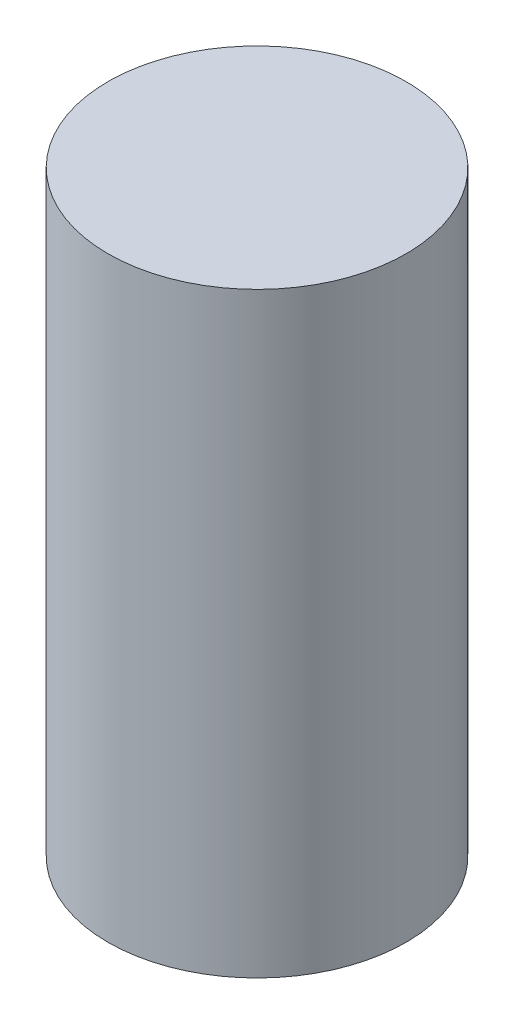
ISO-10303-21;
HEADER;
FILE_DESCRIPTION(('STEP AP214'),'2;1');
FILE_NAME('part.step','',(''),(''),'','','');
FILE_SCHEMA(('AUTOMOTIVE_DESIGN { 1 0 10303 214 1 1 1 1 }'));
ENDSEC;
DATA;
#1=APPLICATION_CONTEXT('core data for automotive mechanical design processes');
#2=APPLICATION_PROTOCOL_DEFINITION('international standard','automotive_design',2000,#1);
#3=PRODUCT_CONTEXT('',#1,'mechanical');
#4=PRODUCT('Part','Part','',(#3));
#5=PRODUCT_RELATED_PRODUCT_CATEGORY('part','',(#4));
#6=PRODUCT_DEFINITION_FORMATION('','',#4);
#7=PRODUCT_DEFINITION_CONTEXT('part definition',#1,'design');
#8=PRODUCT_DEFINITION('design','',#6,#7);
#9=PRODUCT_DEFINITION_SHAPE('','',#8);
#10=(LENGTH_UNIT() NAMED_UNIT(*) SI_UNIT(.MILLI.,.METRE.));
#11=(NAMED_UNIT(*) PLANE_ANGLE_UNIT() SI_UNIT($,.RADIAN.));
#12=(NAMED_UNIT(*) SI_UNIT($,.STERADIAN.) SOLID_ANGLE_UNIT());
#13=UNCERTAINTY_MEASURE_WITH_UNIT(LENGTH_MEASURE(1.E-05),#10,'distance_accuracy_value','');
#14=(GEOMETRIC_REPRESENTATION_CONTEXT(3) GLOBAL_UNCERTAINTY_ASSIGNED_CONTEXT((#13)) GLOBAL_UNIT_ASSIGNED_CONTEXT((#10,
#11,#12)) REPRESENTATION_CONTEXT('',''));
#15=CARTESIAN_POINT('',(0.,0.,0.));
#16=DIRECTION('',(0.,0.,1.));
#17=DIRECTION('',(1.,0.,0.));
#18=AXIS2_PLACEMENT_3D('',#15,#16,#17);
#19=CARTESIAN_POINT('',(0.,40.,0.));
#20=DIRECTION('',(0.,-1.,0.));
#21=DIRECTION('',(0.,0.,-1.));
#22=AXIS2_PLACEMENT_3D('',#19,#20,#21);
#23=CYLINDRICAL_SURFACE('',#22,10.);
#24=CARTESIAN_POINT('',(0.,32.5,-10.));
#25=CARTESIAN_POINT('',(-0.138126814449552,32.4999961237697,-9.99999766446687));
#26=CARTESIAN_POINT('',(-0.276296929717939,32.4885140820437,-9.99710963553044));
#27=CARTESIAN_POINT('',(-0.548677206284221,32.442958081155,-9.98586856383157));
#28=CARTESIAN_POINT('',(-0.682885078117899,32.4088713174369,-9.97751242366627));
#29=CARTESIAN_POINT('',(-0.943368120304297,32.3192679108965,-9.9562604388672));
#30=CARTESIAN_POINT('',(-1.06965260571667,32.2637770021412,-9.94337004736764));
#31=CARTESIAN_POINT('',(-1.31112021984072,32.1330310165919,-9.91442239679369));
#32=CARTESIAN_POINT('',(-1.42630297391461,32.0577752731351,-9.89836503090261));
#33=CARTESIAN_POINT('',(-1.64466987883486,31.8879986839097,-9.86445689319489));
#34=CARTESIAN_POINT('',(-1.74759281676843,31.7931473750682,-9.84657845246877));
#35=CARTESIAN_POINT('',(-1.93624821200554,31.5875796584849,-9.8112270019656));
#36=CARTESIAN_POINT('',(-2.02197872824866,31.4768614617551,-9.79375403816446));
#37=CARTESIAN_POINT('',(-2.17504423799829,31.240674622105,-9.76091292830281));
#38=CARTESIAN_POINT('',(-2.2420870265419,31.1150112819855,-9.74557990774685));
#39=CARTESIAN_POINT('',(-2.35399484758457,30.8537526472333,-9.71915824696694));
#40=CARTESIAN_POINT('',(-2.39886342573357,30.7181589444466,-9.70806892824031));
#41=CARTESIAN_POINT('',(-2.46425806134128,30.4437608363306,-9.69167461160538));
#42=CARTESIAN_POINT('',(-2.48525378055342,30.30507517327,-9.68625818328352));
#43=CARTESIAN_POINT('',(-2.50376962511068,30.0260523850011,-9.68148937432652));
#44=CARTESIAN_POINT('',(-2.50129356969685,29.8857155321798,-9.68213600713214));
#45=CARTESIAN_POINT('',(-2.47331087439951,29.6109736537577,-9.68932009194695));
#46=CARTESIAN_POINT('',(-2.44836390031772,29.4765072975578,-9.69571438345489));
#47=CARTESIAN_POINT('',(-2.37704031150499,29.2137315818149,-9.71344516118448));
#48=CARTESIAN_POINT('',(-2.33066217011566,29.0854226616185,-9.72478199948731));
#49=CARTESIAN_POINT('',(-2.21731579656198,28.8371033062464,-9.75125189842765));
#50=CARTESIAN_POINT('',(-2.1501444453882,28.717189713684,-9.76642212449693));
#51=CARTESIAN_POINT('',(-1.99726046002491,28.4901354837386,-9.79882851409985));
#52=CARTESIAN_POINT('',(-1.91154458134806,28.3829970865546,-9.81606503891047));
#53=CARTESIAN_POINT('',(-1.72110570780204,28.181327307176,-9.85126467566485));
#54=CARTESIAN_POINT('',(-1.61591043027643,28.0872425165644,-9.86923449130002));
#55=CARTESIAN_POINT('',(-1.39101986250616,27.9179645958935,-9.90343275964593));
#56=CARTESIAN_POINT('',(-1.27132412951324,27.8427720428941,-9.91966115915679));
#57=CARTESIAN_POINT('',(-1.02019314780232,27.7132490229594,-9.94862886823651));
#58=CARTESIAN_POINT('',(-0.888718988681038,27.6589910995759,-9.96135600212879));
#59=CARTESIAN_POINT('',(-0.618126680238136,27.5734711571507,-9.98179861652361));
#60=CARTESIAN_POINT('',(-0.479009998584139,27.5422047393031,-9.98951505565468));
#61=CARTESIAN_POINT('',(-0.200899950650044,27.5042373907353,-9.99892498785624));
#62=CARTESIAN_POINT('',(-0.0619945333136825,27.4969282898745,-10.0007675584713));
#63=CARTESIAN_POINT('',(0.215054791335848,27.5054150034258,-9.99864674690754));
#64=CARTESIAN_POINT('',(0.353198766074327,27.5212087379986,-9.99468388736421));
#65=CARTESIAN_POINT('',(0.622690447960818,27.5749515139856,-9.98149301878918));
#66=CARTESIAN_POINT('',(0.754108531614584,27.6125687724616,-9.97234390309647));
#67=CARTESIAN_POINT('',(1.00876215408753,27.7085118067141,-9.94981177723595));
#68=CARTESIAN_POINT('',(1.13199686505442,27.7668396738554,-9.93642833949965));
#69=CARTESIAN_POINT('',(1.36920522404972,27.9037268814578,-9.9065551321037));
#70=CARTESIAN_POINT('',(1.48297573639295,27.9826268539943,-9.89001445610999));
#71=CARTESIAN_POINT('',(1.69587768940552,28.1579831813286,-9.85574181979586));
#72=CARTESIAN_POINT('',(1.79500659828875,28.2544425660294,-9.83800965421578));
#73=CARTESIAN_POINT('',(1.97831761345414,28.4650032680728,-9.80281594932498));
#74=CARTESIAN_POINT('',(2.06207311270184,28.5794795049993,-9.78537173637463));
#75=CARTESIAN_POINT('',(2.20918459835605,28.8212210574476,-9.75321463970069));
#76=CARTESIAN_POINT('',(2.27254149026901,28.9484858049507,-9.73850163474941));
#77=CARTESIAN_POINT('',(2.37658570101224,29.2115095373437,-9.71363491194665));
#78=CARTESIAN_POINT('',(2.41740732773931,29.3472127138538,-9.70345425375809));
#79=CARTESIAN_POINT('',(2.47557609990489,29.6238493964255,-9.68877906706585));
#80=CARTESIAN_POINT('',(2.49292837912652,29.7647817517024,-9.68428329504044));
#81=CARTESIAN_POINT('',(2.50339765056083,30.0435350397693,-9.68158168701612));
#82=CARTESIAN_POINT('',(2.49719649630132,30.1813290585441,-9.68319887888034));
#83=CARTESIAN_POINT('',(2.46229546385366,30.4538398144438,-9.69213181672143));
#84=CARTESIAN_POINT('',(2.43359603781098,30.5885566133553,-9.69944744817732));
#85=CARTESIAN_POINT('',(2.35488553240495,30.8503474317764,-9.71885434473222));
#86=CARTESIAN_POINT('',(2.30500234113404,30.9774621754006,-9.73091692061057));
#87=CARTESIAN_POINT('',(2.18544152267504,31.2216089711893,-9.7584625954084));
#88=CARTESIAN_POINT('',(2.11576115005696,31.3386396219781,-9.77394616867808));
#89=CARTESIAN_POINT('',(1.95644624772859,31.5625910483368,-9.80709390439338));
#90=CARTESIAN_POINT('',(1.86633860485376,31.6691684557066,-9.82480441386302));
#91=CARTESIAN_POINT('',(1.66964895198288,31.8659117413257,-9.86013378743769));
#92=CARTESIAN_POINT('',(1.56306303543524,31.9560737168549,-9.87775262878422));
#93=CARTESIAN_POINT('',(1.33411264450432,32.1190188476077,-9.9112942607945));
#94=CARTESIAN_POINT('',(1.21149737052731,32.1914576894526,-9.92718055609783));
#95=CARTESIAN_POINT('',(0.955443432517463,32.3145791049009,-9.95508208291861));
#96=CARTESIAN_POINT('',(0.822012605727902,32.3652772677476,-9.96710008666302));
#97=CARTESIAN_POINT('',(0.574017088739122,32.4359530505494,-9.98413432609236));
#98=CARTESIAN_POINT('',(0.460633618180116,32.4599187384224,-9.99004308421151));
#99=CARTESIAN_POINT('',(0.23151011922714,32.4919432393699,-9.9979767538658));
#100=CARTESIAN_POINT('',(0.115770268737694,32.5000032488422,-10.0000019575149));
#101=CARTESIAN_POINT('',(0.,32.5,-10.));
#102=B_SPLINE_CURVE_WITH_KNOTS('',3,(#24,#25,#26,#27,#28,#29,#30,#31,#32,#33,#34,#35,#36,#37,
#38,#39,#40,#41,#42,#43,#44,#45,#46,#47,#48,#49,#50,#51,#52,#53,#54,#55,#56,#57,#58,#59,#60,#61,
#62,#63,#64,#65,#66,#67,#68,#69,#70,#71,#72,#73,#74,#75,#76,#77,#78,#79,#80,#81,#82,#83,#84,#85,
#86,#87,#88,#89,#90,#91,#92,#93,#94,#95,#96,#97,#98,#99,#100,#101),.UNSPECIFIED.,.T.,.F.,(4,2,2,
2,2,2,2,2,2,2,2,2,2,2,2,2,2,2,2,2,2,2,2,2,2,2,2,2,2,2,2,2,2,2,2,2,2,2,4),(0.,0.41395618745315,
0.828147062939833,1.24184150381018,1.65554990028222,2.07690725728566,2.4983121596677,
2.92597745909678,3.35357435282281,3.77260491835117,4.19156730193363,4.60037495017232,
5.00921172448932,5.42217546462,5.83521151399139,6.26002501620567,6.6848514926928,
7.11113715020725,7.5373412281994,7.95263848254329,8.36789835193439,8.7770045752893,
9.18615212209352,9.60255979281122,10.0190393835223,10.4457418201299,10.8724253125471,
11.2965375769764,11.7205570543048,12.1323963400749,12.5442273493652,12.9536066760888,
13.3630428023797,13.7831596069298,14.2033761629383,14.6312030917578,15.0587227304538,
15.4057040491338,15.752659267482),.UNSPECIFIED.);
#103=CARTESIAN_POINT('',(0.,32.5,-10.));
#104=VERTEX_POINT('',#103);
#105=EDGE_CURVE('E37',#104,#104,#102,.T.);
#106=ORIENTED_EDGE('',*,*,#105,.T.);
#107=EDGE_LOOP('',(#106));
#108=FACE_BOUND('',#107,.T.);
#109=CARTESIAN_POINT('',(0.,12.5,-10.));
#110=CARTESIAN_POINT('',(-0.138126814449552,12.4999961237697,-9.99999766446687));
#111=CARTESIAN_POINT('',(-0.276296929717938,12.4885140820437,-9.99710963553044));
#112=CARTESIAN_POINT('',(-0.548677206284221,12.442958081155,-9.98586856383157));
#113=CARTESIAN_POINT('',(-0.682885078117899,12.4088713174369,-9.97751242366627));
#114=CARTESIAN_POINT('',(-0.943368120304294,12.3192679108965,-9.9562604388672));
#115=CARTESIAN_POINT('',(-1.06965260571667,12.2637770021412,-9.94337004736764));
#116=CARTESIAN_POINT('',(-1.31112021984071,12.1330310165919,-9.91442239679369));
#117=CARTESIAN_POINT('',(-1.4263029739146,12.0577752731351,-9.89836503090261));
#118=CARTESIAN_POINT('',(-1.64466987883486,11.8879986839097,-9.86445689319489));
#119=CARTESIAN_POINT('',(-1.74759281676843,11.7931473750682,-9.84657845246877));
#120=CARTESIAN_POINT('',(-1.93624821200553,11.5875796584849,-9.8112270019656));
#121=CARTESIAN_POINT('',(-2.02197872824865,11.4768614617551,-9.79375403816446));
#122=CARTESIAN_POINT('',(-2.17504423799829,11.240674622105,-9.76091292830281));
#123=CARTESIAN_POINT('',(-2.2420870265419,11.1150112819855,-9.74557990774685));
#124=CARTESIAN_POINT('',(-2.35399484758457,10.8537526472333,-9.71915824696694));
#125=CARTESIAN_POINT('',(-2.39886342573357,10.7181589444466,-9.70806892824031));
#126=CARTESIAN_POINT('',(-2.46425806134127,10.4437608363306,-9.69167461160538));
#127=CARTESIAN_POINT('',(-2.48525378055342,10.30507517327,-9.68625818328352));
#128=CARTESIAN_POINT('',(-2.50376962511068,10.0260523850011,-9.68148937432652));
#129=CARTESIAN_POINT('',(-2.50129356969685,9.88571553217978,-9.68213600713214));
#130=CARTESIAN_POINT('',(-2.47331087439951,9.61097365375775,-9.68932009194695));
#131=CARTESIAN_POINT('',(-2.44836390031772,9.47650729755779,-9.69571438345489));
#132=CARTESIAN_POINT('',(-2.37704031150499,9.2137315818149,-9.71344516118448));
#133=CARTESIAN_POINT('',(-2.33066217011566,9.08542266161847,-9.72478199948731));
#134=CARTESIAN_POINT('',(-2.21731579656198,8.83710330624645,-9.75125189842765));
#135=CARTESIAN_POINT('',(-2.1501444453882,8.71718971368405,-9.76642212449693));
#136=CARTESIAN_POINT('',(-1.99726046002491,8.49013548373863,-9.79882851409985));
#137=CARTESIAN_POINT('',(-1.91154458134806,8.38299708655458,-9.81606503891047));
#138=CARTESIAN_POINT('',(-1.72110570780204,8.18132730717599,-9.85126467566485));
#139=CARTESIAN_POINT('',(-1.61591043027644,8.08724251656442,-9.86923449130001));
#140=CARTESIAN_POINT('',(-1.39101986250617,7.9179645958935,-9.90343275964594));
#141=CARTESIAN_POINT('',(-1.27132412951324,7.84277204289406,-9.91966115915679));
#142=CARTESIAN_POINT('',(-1.02019314780232,7.71324902295936,-9.94862886823651));
#143=CARTESIAN_POINT('',(-0.888718988681041,7.65899109957595,-9.96135600212879));
#144=CARTESIAN_POINT('',(-0.618126680238139,7.57347115715071,-9.98179861652361));
#145=CARTESIAN_POINT('',(-0.479009998584143,7.5422047393031,-9.98951505565468));
#146=CARTESIAN_POINT('',(-0.200899950650047,7.50423739073527,-9.99892498785624));
#147=CARTESIAN_POINT('',(-0.0619945333136857,7.49692828987449,-10.0007675584713));
#148=CARTESIAN_POINT('',(0.215054791335845,7.50541500342581,-9.99864674690754));
#149=CARTESIAN_POINT('',(0.353198766074325,7.52120873799856,-9.99468388736421));
#150=CARTESIAN_POINT('',(0.622690447960816,7.57495151398563,-9.98149301878918));
#151=CARTESIAN_POINT('',(0.754108531614582,7.61256877246162,-9.97234390309647));
#152=CARTESIAN_POINT('',(1.00876215408753,7.7085118067141,-9.94981177723595));
#153=CARTESIAN_POINT('',(1.13199686505442,7.76683967385537,-9.93642833949965));
#154=CARTESIAN_POINT('',(1.36920522404972,7.90372688145779,-9.9065551321037));
#155=CARTESIAN_POINT('',(1.48297573639294,7.98262685399427,-9.89001445610999));
#156=CARTESIAN_POINT('',(1.69587768940552,8.15798318132861,-9.85574181979586));
#157=CARTESIAN_POINT('',(1.79500659828875,8.25444256602941,-9.83800965421578));
#158=CARTESIAN_POINT('',(1.97831761345414,8.46500326807284,-9.80281594932498));
#159=CARTESIAN_POINT('',(2.06207311270184,8.57947950499927,-9.78537173637463));
#160=CARTESIAN_POINT('',(2.20918459835604,8.82122105744763,-9.75321463970069));
#161=CARTESIAN_POINT('',(2.27254149026901,8.94848580495074,-9.73850163474941));
#162=CARTESIAN_POINT('',(2.37658570101223,9.21150953734373,-9.71363491194665));
#163=CARTESIAN_POINT('',(2.41740732773931,9.34721271385382,-9.70345425375809));
#164=CARTESIAN_POINT('',(2.47557609990489,9.62384939642549,-9.68877906706586));
#165=CARTESIAN_POINT('',(2.49292837912652,9.76478175170241,-9.68428329504044));
#166=CARTESIAN_POINT('',(2.50339765056083,10.0435350397693,-9.68158168701612));
#167=CARTESIAN_POINT('',(2.49719649630132,10.1813290585441,-9.68319887888034));
#168=CARTESIAN_POINT('',(2.46229546385366,10.4538398144438,-9.69213181672143));
#169=CARTESIAN_POINT('',(2.43359603781098,10.5885566133553,-9.69944744817731));
#170=CARTESIAN_POINT('',(2.35488553240496,10.8503474317764,-9.71885434473222));
#171=CARTESIAN_POINT('',(2.30500234113404,10.9774621754005,-9.73091692061057));
#172=CARTESIAN_POINT('',(2.18544152267504,11.2216089711893,-9.7584625954084));
#173=CARTESIAN_POINT('',(2.11576115005696,11.3386396219781,-9.77394616867808));
#174=CARTESIAN_POINT('',(1.95644624772858,11.5625910483368,-9.80709390439337));
#175=CARTESIAN_POINT('',(1.86633860485376,11.6691684557066,-9.82480441386302));
#176=CARTESIAN_POINT('',(1.66964895198289,11.8659117413257,-9.86013378743769));
#177=CARTESIAN_POINT('',(1.56306303543524,11.9560737168549,-9.87775262878422));
#178=CARTESIAN_POINT('',(1.33411264450432,12.1190188476077,-9.91129426079449));
#179=CARTESIAN_POINT('',(1.21149737052731,12.1914576894526,-9.92718055609783));
#180=CARTESIAN_POINT('',(0.955443432517461,12.3145791049009,-9.95508208291861));
#181=CARTESIAN_POINT('',(0.822012605727901,12.3652772677476,-9.96710008666301));
#182=CARTESIAN_POINT('',(0.574017088739121,12.4359530505494,-9.98413432609236));
#183=CARTESIAN_POINT('',(0.460633618180115,12.4599187384224,-9.99004308421151));
#184=CARTESIAN_POINT('',(0.231510119227139,12.4919432393699,-9.9979767538658));
#185=CARTESIAN_POINT('',(0.115770268737694,12.5000032488422,-10.0000019575149));
#186=CARTESIAN_POINT('',(0.,12.5,-10.));
#187=B_SPLINE_CURVE_WITH_KNOTS('',3,(#109,#110,#111,#112,#113,#114,#115,#116,#117,#118,#119,
#120,#121,#122,#123,#124,#125,#126,#127,#128,#129,#130,#131,#132,#133,#134,#135,#136,#137,#138,
#139,#140,#141,#142,#143,#144,#145,#146,#147,#148,#149,#150,#151,#152,#153,#154,#155,#156,#157,
#158,#159,#160,#161,#162,#163,#164,#165,#166,#167,#168,#169,#170,#171,#172,#173,#174,#175,#176,
#177,#178,#179,#180,#181,#182,#183,#184,#185,#186),.UNSPECIFIED.,.T.,.F.,(4,2,2,2,2,2,2,2,2,2,2,
2,2,2,2,2,2,2,2,2,2,2,2,2,2,2,2,2,2,2,2,2,2,2,2,2,2,2,4),(0.,0.413956187453149,
0.828147062939833,1.24184150381018,1.65554990028221,2.07690725728565,2.4983121596677,
2.92597745909678,3.35357435282281,3.77260491835116,4.19156730193362,4.60037495017231,
5.00921172448932,5.42217546462,5.83521151399139,6.26002501620567,6.6848514926928,
7.11113715020725,7.53734122819939,7.95263848254328,8.36789835193439,8.7770045752893,
9.18615212209352,9.60255979281121,10.0190393835223,10.4457418201299,10.8724253125471,
11.2965375769764,11.7205570543048,12.1323963400748,12.5442273493652,12.9536066760888,
13.3630428023797,13.7831596069298,14.2033761629383,14.6312030917578,15.0587227304538,
15.4057040491338,15.752659267482),.UNSPECIFIED.);
#188=CARTESIAN_POINT('',(0.,12.5,-10.));
#189=VERTEX_POINT('',#188);
#190=EDGE_CURVE('E54',#189,#189,#187,.T.);
#191=ORIENTED_EDGE('',*,*,#190,.T.);
#192=EDGE_LOOP('',(#191));
#193=FACE_BOUND('',#192,.T.);
#194=CARTESIAN_POINT('',(0.,40.,0.));
#195=DIRECTION('',(0.,1.,0.));
#196=DIRECTION('',(0.,0.,1.));
#197=AXIS2_PLACEMENT_3D('',#194,#195,#196);
#198=CIRCLE('',#197,10.);
#199=CARTESIAN_POINT('',(0.,40.,10.));
#200=VERTEX_POINT('',#199);
#201=EDGE_CURVE('E10',#200,#200,#198,.T.);
#202=ORIENTED_EDGE('',*,*,#201,.F.);
#203=EDGE_LOOP('',(#202));
#204=FACE_BOUND('',#203,.T.);
#205=CARTESIAN_POINT('',(0.,0.,0.));
#206=DIRECTION('',(0.,1.,0.));
#207=DIRECTION('',(0.,0.,1.));
#208=AXIS2_PLACEMENT_3D('',#205,#206,#207);
#209=CIRCLE('',#208,10.);
#210=CARTESIAN_POINT('',(0.,0.,10.));
#211=VERTEX_POINT('',#210);
#212=EDGE_CURVE('E45',#211,#211,#209,.T.);
#213=ORIENTED_EDGE('',*,*,#212,.T.);
#214=EDGE_LOOP('',(#213));
#215=FACE_BOUND('',#214,.T.);
#216=ADVANCED_FACE('F33',(#108,#193,#204,#215),#23,.T.);
#217=CARTESIAN_POINT('',(0.,40.,0.));
#218=DIRECTION('',(0.,1.,0.));
#219=DIRECTION('',(0.,0.,1.));
#220=AXIS2_PLACEMENT_3D('',#217,#218,#219);
#221=PLANE('',#220);
#222=ORIENTED_EDGE('',*,*,#201,.T.);
#223=EDGE_LOOP('',(#222));
#224=FACE_BOUND('',#223,.T.);
#225=ADVANCED_FACE('F69',(#224),#221,.T.);
#226=CARTESIAN_POINT('',(0.,0.,0.));
#227=DIRECTION('',(0.,1.,0.));
#228=DIRECTION('',(0.,0.,1.));
#229=AXIS2_PLACEMENT_3D('',#226,#227,#228);
#230=PLANE('',#229);
#231=ORIENTED_EDGE('',*,*,#212,.F.);
#232=EDGE_LOOP('',(#231));
#233=FACE_BOUND('',#232,.T.);
#234=ADVANCED_FACE('F67',(#233),#230,.F.);
#235=CARTESIAN_POINT('',(0.,10.,-40.));
#236=DIRECTION('',(0.,0.,1.));
#237=DIRECTION('',(1.,0.,0.));
#238=AXIS2_PLACEMENT_3D('',#235,#236,#237);
#239=CYLINDRICAL_SURFACE('',#238,2.5);
#240=CARTESIAN_POINT('',(0.,10.,0.));
#241=DIRECTION('',(0.,0.,1.));
#242=DIRECTION('',(1.,0.,0.));
#243=AXIS2_PLACEMENT_3D('',#240,#241,#242);
#244=CIRCLE('',#243,2.5);
#245=CARTESIAN_POINT('',(2.5,10.,0.));
#246=VERTEX_POINT('',#245);
#247=EDGE_CURVE('E52',#246,#246,#244,.T.);
#248=ORIENTED_EDGE('',*,*,#247,.T.);
#249=EDGE_LOOP('',(#248));
#250=FACE_BOUND('',#249,.T.);
#251=ORIENTED_EDGE('',*,*,#190,.F.);
#252=EDGE_LOOP('',(#251));
#253=FACE_BOUND('',#252,.T.);
#254=ADVANCED_FACE('F61',(#250,#253),#239,.F.);
#255=CARTESIAN_POINT('',(0.,10.,0.));
#256=DIRECTION('',(0.,0.,1.));
#257=DIRECTION('',(1.,0.,0.));
#258=AXIS2_PLACEMENT_3D('',#255,#256,#257);
#259=PLANE('',#258);
#260=ORIENTED_EDGE('',*,*,#247,.F.);
#261=EDGE_LOOP('',(#260));
#262=FACE_BOUND('',#261,.T.);
#263=ADVANCED_FACE('F66',(#262),#259,.F.);
#264=CARTESIAN_POINT('',(0.,30.,-40.));
#265=DIRECTION('',(0.,0.,1.));
#266=DIRECTION('',(1.,0.,0.));
#267=AXIS2_PLACEMENT_3D('',#264,#265,#266);
#268=CYLINDRICAL_SURFACE('',#267,2.5);
#269=CARTESIAN_POINT('',(0.,30.,0.));
#270=DIRECTION('',(0.,0.,1.));
#271=DIRECTION('',(1.,0.,0.));
#272=AXIS2_PLACEMENT_3D('',#269,#270,#271);
#273=CIRCLE('',#272,2.5);
#274=CARTESIAN_POINT('',(2.5,30.,0.));
#275=VERTEX_POINT('',#274);
#276=EDGE_CURVE('E60',#275,#275,#273,.T.);
#277=ORIENTED_EDGE('',*,*,#276,.T.);
#278=EDGE_LOOP('',(#277));
#279=FACE_BOUND('',#278,.T.);
#280=ORIENTED_EDGE('',*,*,#105,.F.);
#281=EDGE_LOOP('',(#280));
#282=FACE_BOUND('',#281,.T.);
#283=ADVANCED_FACE('F88',(#279,#282),#268,.F.);
#284=CARTESIAN_POINT('',(0.,30.,0.));
#285=DIRECTION('',(0.,0.,1.));
#286=DIRECTION('',(1.,0.,0.));
#287=AXIS2_PLACEMENT_3D('',#284,#285,#286);
#288=PLANE('',#287);
#289=ORIENTED_EDGE('',*,*,#276,.F.);
#290=EDGE_LOOP('',(#289));
#291=FACE_BOUND('',#290,.T.);
#292=ADVANCED_FACE('F90',(#291),#288,.F.);
#293=CLOSED_SHELL('',(#216,#225,#234,#254,#263,#283,#292));
#294=MANIFOLD_SOLID_BREP('B2',#293);
#295=ADVANCED_BREP_SHAPE_REPRESENTATION('',(#18,#294),#14);
#296=SHAPE_DEFINITION_REPRESENTATION(#9,#295);
ENDSEC;
END-ISO-10303-21;
